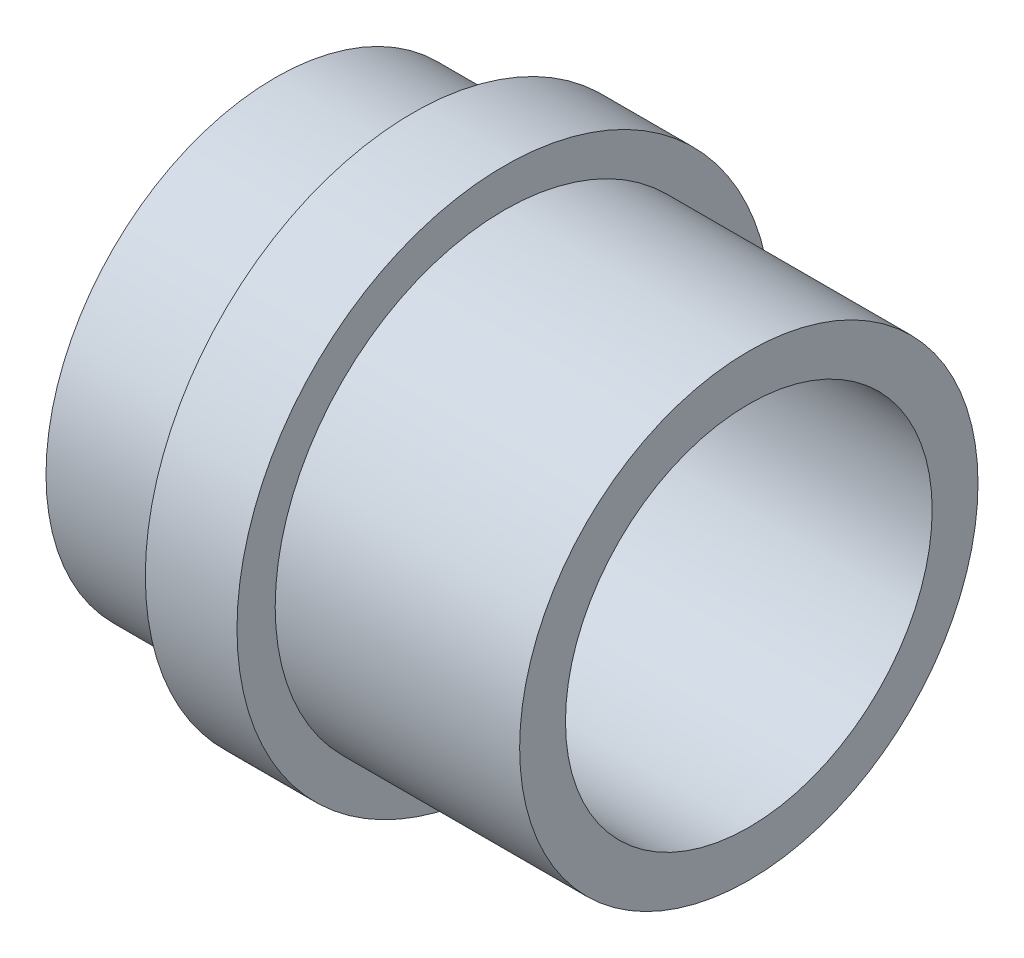
ISO-10303-21;
HEADER;
FILE_DESCRIPTION(('STEP AP214'),'2;1');
FILE_NAME('part.step','',(''),(''),'','','');
FILE_SCHEMA(('AUTOMOTIVE_DESIGN { 1 0 10303 214 1 1 1 1 }'));
ENDSEC;
DATA;
#1=APPLICATION_CONTEXT('core data for automotive mechanical design processes');
#2=APPLICATION_PROTOCOL_DEFINITION('international standard','automotive_design',2000,#1);
#3=PRODUCT_CONTEXT('',#1,'mechanical');
#4=PRODUCT('Part','Part','',(#3));
#5=PRODUCT_RELATED_PRODUCT_CATEGORY('part','',(#4));
#6=PRODUCT_DEFINITION_FORMATION('','',#4);
#7=PRODUCT_DEFINITION_CONTEXT('part definition',#1,'design');
#8=PRODUCT_DEFINITION('design','',#6,#7);
#9=PRODUCT_DEFINITION_SHAPE('','',#8);
#10=(LENGTH_UNIT() NAMED_UNIT(*) SI_UNIT(.MILLI.,.METRE.));
#11=(NAMED_UNIT(*) PLANE_ANGLE_UNIT() SI_UNIT($,.RADIAN.));
#12=(NAMED_UNIT(*) SI_UNIT($,.STERADIAN.) SOLID_ANGLE_UNIT());
#13=UNCERTAINTY_MEASURE_WITH_UNIT(LENGTH_MEASURE(1.E-05),#10,'distance_accuracy_value','');
#14=(GEOMETRIC_REPRESENTATION_CONTEXT(3) GLOBAL_UNCERTAINTY_ASSIGNED_CONTEXT((#13)) GLOBAL_UNIT_ASSIGNED_CONTEXT((#10,
#11,#12)) REPRESENTATION_CONTEXT('',''));
#15=CARTESIAN_POINT('',(0.,0.,0.));
#16=DIRECTION('',(0.,0.,1.));
#17=DIRECTION('',(1.,0.,0.));
#18=AXIS2_PLACEMENT_3D('',#15,#16,#17);
#19=CARTESIAN_POINT('',(31.,0.,0.));
#20=DIRECTION('',(1.,0.,0.));
#21=DIRECTION('',(0.,0.,-1.));
#22=AXIS2_PLACEMENT_3D('',#19,#20,#21);
#23=CYLINDRICAL_SURFACE('',#22,15.);
#24=CARTESIAN_POINT('',(0.,0.,0.));
#25=DIRECTION('',(1.,0.,0.));
#26=DIRECTION('',(0.,0.,-1.));
#27=AXIS2_PLACEMENT_3D('',#24,#25,#26);
#28=CIRCLE('',#27,15.);
#29=CARTESIAN_POINT('',(0.,0.,-15.));
#30=VERTEX_POINT('',#29);
#31=EDGE_CURVE('E52',#30,#30,#28,.T.);
#32=ORIENTED_EDGE('',*,*,#31,.T.);
#33=EDGE_LOOP('',(#32));
#34=FACE_BOUND('',#33,.T.);
#35=CARTESIAN_POINT('',(9.,0.,0.));
#36=DIRECTION('',(1.,0.,0.));
#37=DIRECTION('',(0.,0.,-1.));
#38=AXIS2_PLACEMENT_3D('',#35,#36,#37);
#39=CIRCLE('',#38,15.);
#40=CARTESIAN_POINT('',(9.,0.,-15.));
#41=VERTEX_POINT('',#40);
#42=EDGE_CURVE('E48',#41,#41,#39,.T.);
#43=ORIENTED_EDGE('',*,*,#42,.F.);
#44=EDGE_LOOP('',(#43));
#45=FACE_BOUND('',#44,.T.);
#46=ADVANCED_FACE('F15',(#34,#45),#23,.T.);
#47=CARTESIAN_POINT('',(0.,15.,0.));
#48=DIRECTION('',(-1.,0.,0.));
#49=DIRECTION('',(0.,0.,1.));
#50=AXIS2_PLACEMENT_3D('',#47,#48,#49);
#51=PLANE('',#50);
#52=CARTESIAN_POINT('',(0.,0.,0.));
#53=DIRECTION('',(1.,0.,0.));
#54=DIRECTION('',(0.,0.,-1.));
#55=AXIS2_PLACEMENT_3D('',#52,#53,#54);
#56=CIRCLE('',#55,12.);
#57=CARTESIAN_POINT('',(0.,0.,-12.));
#58=VERTEX_POINT('',#57);
#59=EDGE_CURVE('E44',#58,#58,#56,.T.);
#60=ORIENTED_EDGE('',*,*,#59,.T.);
#61=EDGE_LOOP('',(#60));
#62=FACE_BOUND('',#61,.T.);
#63=ORIENTED_EDGE('',*,*,#31,.F.);
#64=EDGE_LOOP('',(#63));
#65=FACE_BOUND('',#64,.T.);
#66=ADVANCED_FACE('F59',(#62,#65),#51,.T.);
#67=CARTESIAN_POINT('',(9.,17.5,0.));
#68=DIRECTION('',(-1.,0.,0.));
#69=DIRECTION('',(0.,0.,1.));
#70=AXIS2_PLACEMENT_3D('',#67,#68,#69);
#71=PLANE('',#70);
#72=ORIENTED_EDGE('',*,*,#42,.T.);
#73=EDGE_LOOP('',(#72));
#74=FACE_BOUND('',#73,.T.);
#75=CARTESIAN_POINT('',(9.,0.,0.));
#76=DIRECTION('',(1.,0.,0.));
#77=DIRECTION('',(0.,0.,-1.));
#78=AXIS2_PLACEMENT_3D('',#75,#76,#77);
#79=CIRCLE('',#78,17.5);
#80=CARTESIAN_POINT('',(9.,0.,-17.5));
#81=VERTEX_POINT('',#80);
#82=EDGE_CURVE('E40',#81,#81,#79,.T.);
#83=ORIENTED_EDGE('',*,*,#82,.F.);
#84=EDGE_LOOP('',(#83));
#85=FACE_BOUND('',#84,.T.);
#86=ADVANCED_FACE('F61',(#74,#85),#71,.T.);
#87=CARTESIAN_POINT('',(31.,0.,0.));
#88=DIRECTION('',(1.,0.,0.));
#89=DIRECTION('',(0.,0.,-1.));
#90=AXIS2_PLACEMENT_3D('',#87,#88,#89);
#91=CYLINDRICAL_SURFACE('',#90,12.);
#92=CARTESIAN_POINT('',(31.,0.,0.));
#93=DIRECTION('',(1.,0.,0.));
#94=DIRECTION('',(0.,0.,-1.));
#95=AXIS2_PLACEMENT_3D('',#92,#93,#94);
#96=CIRCLE('',#95,12.);
#97=CARTESIAN_POINT('',(31.,0.,-12.));
#98=VERTEX_POINT('',#97);
#99=EDGE_CURVE('E34',#98,#98,#96,.T.);
#100=ORIENTED_EDGE('',*,*,#99,.T.);
#101=EDGE_LOOP('',(#100));
#102=FACE_BOUND('',#101,.T.);
#103=ORIENTED_EDGE('',*,*,#59,.F.);
#104=EDGE_LOOP('',(#103));
#105=FACE_BOUND('',#104,.T.);
#106=ADVANCED_FACE('F69',(#102,#105),#91,.F.);
#107=CARTESIAN_POINT('',(31.,0.,0.));
#108=DIRECTION('',(1.,0.,0.));
#109=DIRECTION('',(0.,0.,-1.));
#110=AXIS2_PLACEMENT_3D('',#107,#108,#109);
#111=CYLINDRICAL_SURFACE('',#110,17.5);
#112=ORIENTED_EDGE('',*,*,#82,.T.);
#113=EDGE_LOOP('',(#112));
#114=FACE_BOUND('',#113,.T.);
#115=CARTESIAN_POINT('',(15.,0.,0.));
#116=DIRECTION('',(1.,0.,0.));
#117=DIRECTION('',(0.,0.,-1.));
#118=AXIS2_PLACEMENT_3D('',#115,#116,#117);
#119=CIRCLE('',#118,17.5);
#120=CARTESIAN_POINT('',(15.,0.,-17.5));
#121=VERTEX_POINT('',#120);
#122=EDGE_CURVE('E29',#121,#121,#119,.T.);
#123=ORIENTED_EDGE('',*,*,#122,.F.);
#124=EDGE_LOOP('',(#123));
#125=FACE_BOUND('',#124,.T.);
#126=ADVANCED_FACE('F76',(#114,#125),#111,.T.);
#127=CARTESIAN_POINT('',(31.,12.,0.));
#128=DIRECTION('',(1.,0.,0.));
#129=DIRECTION('',(0.,0.,-1.));
#130=AXIS2_PLACEMENT_3D('',#127,#128,#129);
#131=PLANE('',#130);
#132=CARTESIAN_POINT('',(31.,0.,0.));
#133=DIRECTION('',(1.,0.,0.));
#134=DIRECTION('',(0.,0.,-1.));
#135=AXIS2_PLACEMENT_3D('',#132,#133,#134);
#136=CIRCLE('',#135,15.);
#137=CARTESIAN_POINT('',(31.,0.,-15.));
#138=VERTEX_POINT('',#137);
#139=EDGE_CURVE('E23',#138,#138,#136,.T.);
#140=ORIENTED_EDGE('',*,*,#139,.T.);
#141=EDGE_LOOP('',(#140));
#142=FACE_BOUND('',#141,.T.);
#143=ORIENTED_EDGE('',*,*,#99,.F.);
#144=EDGE_LOOP('',(#143));
#145=FACE_BOUND('',#144,.T.);
#146=ADVANCED_FACE('F80',(#142,#145),#131,.T.);
#147=CARTESIAN_POINT('',(15.,15.,0.));
#148=DIRECTION('',(1.,0.,0.));
#149=DIRECTION('',(0.,0.,-1.));
#150=AXIS2_PLACEMENT_3D('',#147,#148,#149);
#151=PLANE('',#150);
#152=ORIENTED_EDGE('',*,*,#122,.T.);
#153=EDGE_LOOP('',(#152));
#154=FACE_BOUND('',#153,.T.);
#155=CARTESIAN_POINT('',(15.,0.,0.));
#156=DIRECTION('',(1.,0.,0.));
#157=DIRECTION('',(0.,0.,-1.));
#158=AXIS2_PLACEMENT_3D('',#155,#156,#157);
#159=CIRCLE('',#158,15.);
#160=CARTESIAN_POINT('',(15.,0.,-15.));
#161=VERTEX_POINT('',#160);
#162=EDGE_CURVE('E10',#161,#161,#159,.T.);
#163=ORIENTED_EDGE('',*,*,#162,.F.);
#164=EDGE_LOOP('',(#163));
#165=FACE_BOUND('',#164,.T.);
#166=ADVANCED_FACE('F83',(#154,#165),#151,.T.);
#167=CARTESIAN_POINT('',(31.,0.,0.));
#168=DIRECTION('',(1.,0.,0.));
#169=DIRECTION('',(0.,0.,-1.));
#170=AXIS2_PLACEMENT_3D('',#167,#168,#169);
#171=CYLINDRICAL_SURFACE('',#170,15.);
#172=ORIENTED_EDGE('',*,*,#162,.T.);
#173=EDGE_LOOP('',(#172));
#174=FACE_BOUND('',#173,.T.);
#175=ORIENTED_EDGE('',*,*,#139,.F.);
#176=EDGE_LOOP('',(#175));
#177=FACE_BOUND('',#176,.T.);
#178=ADVANCED_FACE('F17',(#174,#177),#171,.T.);
#179=CLOSED_SHELL('',(#46,#66,#86,#106,#126,#146,#166,#178));
#180=MANIFOLD_SOLID_BREP('B1',#179);
#181=ADVANCED_BREP_SHAPE_REPRESENTATION('',(#18,#180),#14);
#182=SHAPE_DEFINITION_REPRESENTATION(#9,#181);
ENDSEC;
END-ISO-10303-21;
